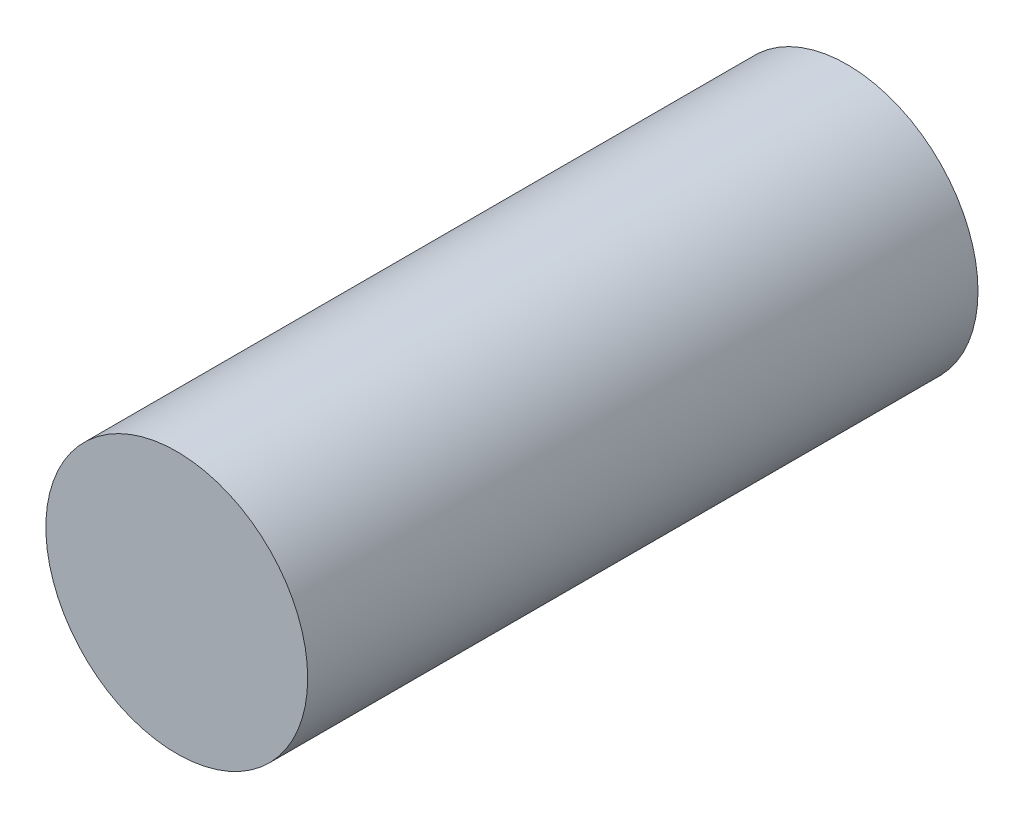
ISO-10303-21;
HEADER;
FILE_DESCRIPTION(('STEP AP214'),'2;1');
FILE_NAME('part.step','',(''),(''),'','','');
FILE_SCHEMA(('AUTOMOTIVE_DESIGN { 1 0 10303 214 1 1 1 1 }'));
ENDSEC;
DATA;
#1=APPLICATION_CONTEXT('core data for automotive mechanical design processes');
#2=APPLICATION_PROTOCOL_DEFINITION('international standard','automotive_design',2000,#1);
#3=PRODUCT_CONTEXT('',#1,'mechanical');
#4=PRODUCT('Part','Part','',(#3));
#5=PRODUCT_RELATED_PRODUCT_CATEGORY('part','',(#4));
#6=PRODUCT_DEFINITION_FORMATION('','',#4);
#7=PRODUCT_DEFINITION_CONTEXT('part definition',#1,'design');
#8=PRODUCT_DEFINITION('design','',#6,#7);
#9=PRODUCT_DEFINITION_SHAPE('','',#8);
#10=(LENGTH_UNIT() NAMED_UNIT(*) SI_UNIT(.MILLI.,.METRE.));
#11=(NAMED_UNIT(*) PLANE_ANGLE_UNIT() SI_UNIT($,.RADIAN.));
#12=(NAMED_UNIT(*) SI_UNIT($,.STERADIAN.) SOLID_ANGLE_UNIT());
#13=UNCERTAINTY_MEASURE_WITH_UNIT(LENGTH_MEASURE(1.E-05),#10,'distance_accuracy_value','');
#14=(GEOMETRIC_REPRESENTATION_CONTEXT(3) GLOBAL_UNCERTAINTY_ASSIGNED_CONTEXT((#13)) GLOBAL_UNIT_ASSIGNED_CONTEXT((#10,
#11,#12)) REPRESENTATION_CONTEXT('',''));
#15=CARTESIAN_POINT('',(0.,0.,0.));
#16=DIRECTION('',(0.,0.,1.));
#17=DIRECTION('',(1.,0.,0.));
#18=AXIS2_PLACEMENT_3D('',#15,#16,#17);
#19=CARTESIAN_POINT('',(0.,0.,64.));
#20=DIRECTION('',(0.,0.,-1.));
#21=DIRECTION('',(-1.,0.,0.));
#22=AXIS2_PLACEMENT_3D('',#19,#20,#21);
#23=CYLINDRICAL_SURFACE('',#22,12.5);
#24=CARTESIAN_POINT('',(0.,0.,64.));
#25=DIRECTION('',(0.,0.,1.));
#26=DIRECTION('',(1.,0.,0.));
#27=AXIS2_PLACEMENT_3D('',#24,#25,#26);
#28=CIRCLE('',#27,12.5);
#29=CARTESIAN_POINT('',(12.5,0.,64.));
#30=VERTEX_POINT('',#29);
#31=EDGE_CURVE('E10',#30,#30,#28,.T.);
#32=ORIENTED_EDGE('',*,*,#31,.F.);
#33=EDGE_LOOP('',(#32));
#34=FACE_BOUND('',#33,.T.);
#35=CARTESIAN_POINT('',(0.,0.,0.));
#36=DIRECTION('',(0.,0.,1.));
#37=DIRECTION('',(1.,0.,0.));
#38=AXIS2_PLACEMENT_3D('',#35,#36,#37);
#39=CIRCLE('',#38,12.5);
#40=CARTESIAN_POINT('',(12.5,0.,0.));
#41=VERTEX_POINT('',#40);
#42=EDGE_CURVE('E40',#41,#41,#39,.T.);
#43=ORIENTED_EDGE('',*,*,#42,.T.);
#44=EDGE_LOOP('',(#43));
#45=FACE_BOUND('',#44,.T.);
#46=ADVANCED_FACE('F37',(#34,#45),#23,.T.);
#47=CARTESIAN_POINT('',(0.,0.,64.));
#48=DIRECTION('',(0.,0.,1.));
#49=DIRECTION('',(1.,0.,0.));
#50=AXIS2_PLACEMENT_3D('',#47,#48,#49);
#51=PLANE('',#50);
#52=ORIENTED_EDGE('',*,*,#31,.T.);
#53=EDGE_LOOP('',(#52));
#54=FACE_BOUND('',#53,.T.);
#55=ADVANCED_FACE('F54',(#54),#51,.T.);
#56=CARTESIAN_POINT('',(0.,0.,0.));
#57=DIRECTION('',(0.,0.,1.));
#58=DIRECTION('',(1.,0.,0.));
#59=AXIS2_PLACEMENT_3D('',#56,#57,#58);
#60=PLANE('',#59);
#61=ORIENTED_EDGE('',*,*,#42,.F.);
#62=EDGE_LOOP('',(#61));
#63=FACE_BOUND('',#62,.T.);
#64=ADVANCED_FACE('F52',(#63),#60,.F.);
#65=CLOSED_SHELL('',(#46,#55,#64));
#66=MANIFOLD_SOLID_BREP('B2',#65);
#67=ADVANCED_BREP_SHAPE_REPRESENTATION('',(#18,#66),#14);
#68=SHAPE_DEFINITION_REPRESENTATION(#9,#67);
ENDSEC;
END-ISO-10303-21;
